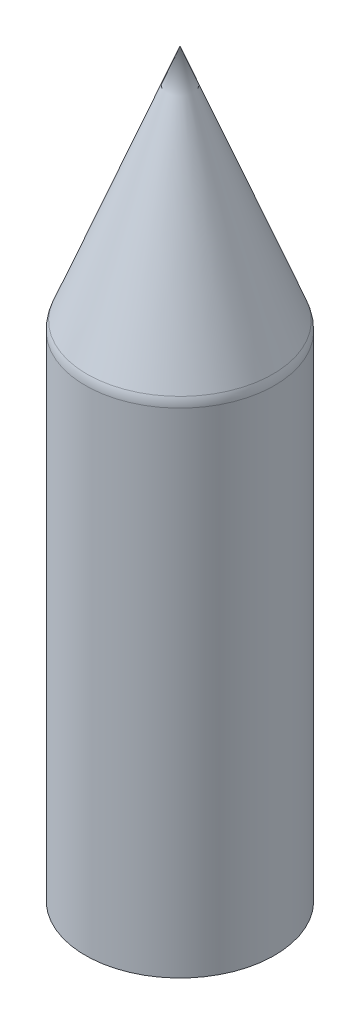
ISO-10303-21;
HEADER;
FILE_DESCRIPTION(('STEP AP214'),'2;1');
FILE_NAME('part.step','',(''),(''),'','','');
FILE_SCHEMA(('AUTOMOTIVE_DESIGN { 1 0 10303 214 1 1 1 1 }'));
ENDSEC;
DATA;
#1=APPLICATION_CONTEXT('core data for automotive mechanical design processes');
#2=APPLICATION_PROTOCOL_DEFINITION('international standard','automotive_design',2000,#1);
#3=PRODUCT_CONTEXT('',#1,'mechanical');
#4=PRODUCT('Part','Part','',(#3));
#5=PRODUCT_RELATED_PRODUCT_CATEGORY('part','',(#4));
#6=PRODUCT_DEFINITION_FORMATION('','',#4);
#7=PRODUCT_DEFINITION_CONTEXT('part definition',#1,'design');
#8=PRODUCT_DEFINITION('design','',#6,#7);
#9=PRODUCT_DEFINITION_SHAPE('','',#8);
#10=(LENGTH_UNIT() NAMED_UNIT(*) SI_UNIT(.MILLI.,.METRE.));
#11=(NAMED_UNIT(*) PLANE_ANGLE_UNIT() SI_UNIT($,.RADIAN.));
#12=(NAMED_UNIT(*) SI_UNIT($,.STERADIAN.) SOLID_ANGLE_UNIT());
#13=UNCERTAINTY_MEASURE_WITH_UNIT(LENGTH_MEASURE(1.E-05),#10,'distance_accuracy_value','');
#14=(GEOMETRIC_REPRESENTATION_CONTEXT(3) GLOBAL_UNCERTAINTY_ASSIGNED_CONTEXT((#13)) GLOBAL_UNIT_ASSIGNED_CONTEXT((#10,
#11,#12)) REPRESENTATION_CONTEXT('',''));
#15=CARTESIAN_POINT('',(0.,0.,0.));
#16=DIRECTION('',(0.,0.,1.));
#17=DIRECTION('',(1.,0.,0.));
#18=AXIS2_PLACEMENT_3D('',#15,#16,#17);
#19=CARTESIAN_POINT('',(0.,0.,0.));
#20=DIRECTION('',(0.,-1.,0.));
#21=DIRECTION('',(0.,0.,-1.));
#22=AXIS2_PLACEMENT_3D('',#19,#20,#21);
#23=PLANE('',#22);
#24=CARTESIAN_POINT('',(0.,0.,0.));
#25=DIRECTION('',(0.,-1.,0.));
#26=DIRECTION('',(0.,0.,-1.));
#27=AXIS2_PLACEMENT_3D('',#24,#25,#26);
#28=CIRCLE('',#27,115.);
#29=CARTESIAN_POINT('',(0.,0.,-115.));
#30=VERTEX_POINT('',#29);
#31=EDGE_CURVE('E11',#30,#30,#28,.T.);
#32=ORIENTED_EDGE('',*,*,#31,.T.);
#33=EDGE_LOOP('',(#32));
#34=FACE_BOUND('',#33,.T.);
#35=ADVANCED_FACE('F43',(#34),#23,.T.);
#36=CARTESIAN_POINT('',(0.,0.,0.));
#37=DIRECTION('',(0.,-1.,0.));
#38=DIRECTION('',(0.,0.,-1.));
#39=AXIS2_PLACEMENT_3D('',#36,#37,#38);
#40=CYLINDRICAL_SURFACE('',#39,115.);
#41=CARTESIAN_POINT('',(0.,600.,0.));
#42=DIRECTION('',(0.,-1.,0.));
#43=DIRECTION('',(0.,0.,-1.));
#44=AXIS2_PLACEMENT_3D('',#41,#42,#43);
#45=CIRCLE('',#44,115.);
#46=CARTESIAN_POINT('',(0.,600.,-115.));
#47=VERTEX_POINT('',#46);
#48=EDGE_CURVE('E50',#47,#47,#45,.T.);
#49=ORIENTED_EDGE('',*,*,#48,.T.);
#50=EDGE_LOOP('',(#49));
#51=FACE_BOUND('',#50,.T.);
#52=ORIENTED_EDGE('',*,*,#31,.F.);
#53=EDGE_LOOP('',(#52));
#54=FACE_BOUND('',#53,.T.);
#55=ADVANCED_FACE('F68',(#51,#54),#40,.T.);
#56=CARTESIAN_POINT('',(0.,600.,0.));
#57=DIRECTION('',(0.,-1.,0.));
#58=DIRECTION('',(0.,0.,-1.));
#59=AXIS2_PLACEMENT_3D('',#56,#57,#58);
#60=TOROIDAL_SURFACE('',#59,85.,30.);
#61=CARTESIAN_POINT('',(0.,610.917200948262,0.));
#62=DIRECTION('',(0.,-1.,0.));
#63=DIRECTION('',(0.,0.,-1.));
#64=AXIS2_PLACEMENT_3D('',#61,#62,#63);
#65=CIRCLE('',#64,112.943062170336);
#66=CARTESIAN_POINT('',(0.,610.917200948262,-112.943062170336));
#67=VERTEX_POINT('',#66);
#68=EDGE_CURVE('E60',#67,#67,#65,.T.);
#69=ORIENTED_EDGE('',*,*,#68,.T.);
#70=EDGE_LOOP('',(#69));
#71=FACE_BOUND('',#70,.T.);
#72=ORIENTED_EDGE('',*,*,#48,.F.);
#73=EDGE_LOOP('',(#72));
#74=FACE_BOUND('',#73,.T.);
#75=ADVANCED_FACE('F56',(#71,#74),#60,.T.);
#76=CARTESIAN_POINT('',(0.,610.917200948262,0.));
#77=DIRECTION('',(0.,-1.,0.));
#78=DIRECTION('',(0.,0.,-1.));
#79=AXIS2_PLACEMENT_3D('',#76,#77,#78);
#80=CONICAL_SURFACE('',#79,112.943062170336,0.372458751957075);
#81=CARTESIAN_POINT('',(0.,900.,0.));
#82=VERTEX_POINT('',#81);
#83=VERTEX_LOOP('',#82);
#84=FACE_BOUND('',#83,.T.);
#85=ORIENTED_EDGE('',*,*,#68,.F.);
#86=EDGE_LOOP('',(#85));
#87=FACE_BOUND('',#86,.T.);
#88=ADVANCED_FACE('F53',(#84,#87),#80,.T.);
#89=CLOSED_SHELL('',(#35,#55,#75,#88));
#90=MANIFOLD_SOLID_BREP('B2',#89);
#91=ADVANCED_BREP_SHAPE_REPRESENTATION('',(#18,#90),#14);
#92=SHAPE_DEFINITION_REPRESENTATION(#9,#91);
ENDSEC;
END-ISO-10303-21;
